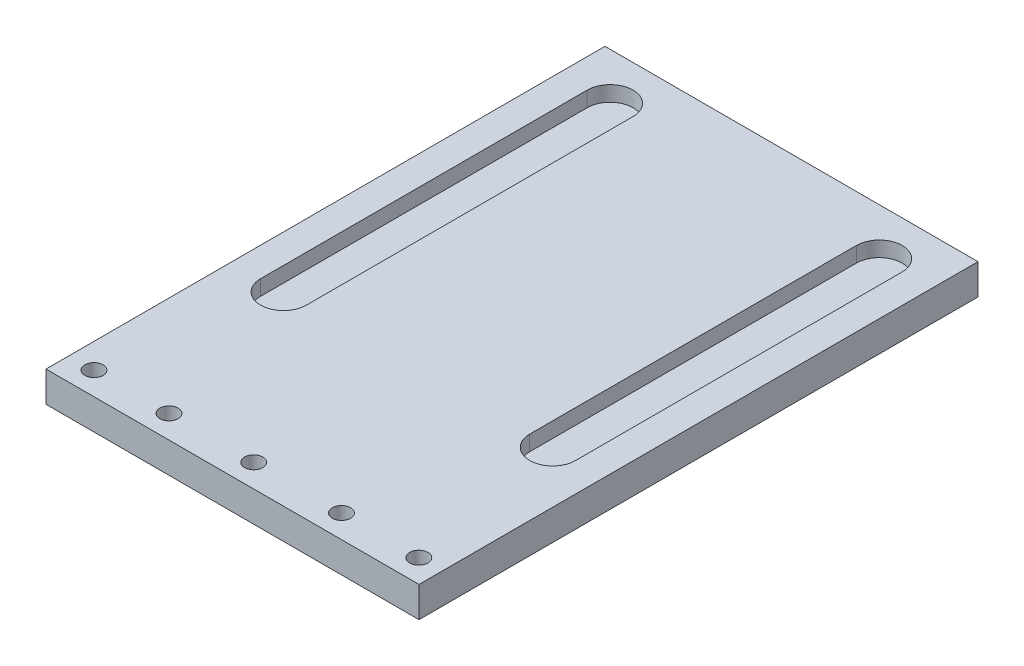
ISO-10303-21;
HEADER;
FILE_DESCRIPTION(('STEP AP214'),'2;1');
FILE_NAME('part.step','',(''),(''),'','','');
FILE_SCHEMA(('AUTOMOTIVE_DESIGN { 1 0 10303 214 1 1 1 1 }'));
ENDSEC;
DATA;
#1=APPLICATION_CONTEXT('core data for automotive mechanical design processes');
#2=APPLICATION_PROTOCOL_DEFINITION('international standard','automotive_design',2000,#1);
#3=PRODUCT_CONTEXT('',#1,'mechanical');
#4=PRODUCT('Part','Part','',(#3));
#5=PRODUCT_RELATED_PRODUCT_CATEGORY('part','',(#4));
#6=PRODUCT_DEFINITION_FORMATION('','',#4);
#7=PRODUCT_DEFINITION_CONTEXT('part definition',#1,'design');
#8=PRODUCT_DEFINITION('design','',#6,#7);
#9=PRODUCT_DEFINITION_SHAPE('','',#8);
#10=(LENGTH_UNIT() NAMED_UNIT(*) SI_UNIT(.MILLI.,.METRE.));
#11=(NAMED_UNIT(*) PLANE_ANGLE_UNIT() SI_UNIT($,.RADIAN.));
#12=(NAMED_UNIT(*) SI_UNIT($,.STERADIAN.) SOLID_ANGLE_UNIT());
#13=UNCERTAINTY_MEASURE_WITH_UNIT(LENGTH_MEASURE(1.E-05),#10,'distance_accuracy_value','');
#14=(GEOMETRIC_REPRESENTATION_CONTEXT(3) GLOBAL_UNCERTAINTY_ASSIGNED_CONTEXT((#13)) GLOBAL_UNIT_ASSIGNED_CONTEXT((#10,
#11,#12)) REPRESENTATION_CONTEXT('',''));
#15=CARTESIAN_POINT('',(0.,0.,0.));
#16=DIRECTION('',(0.,0.,1.));
#17=DIRECTION('',(1.,0.,0.));
#18=AXIS2_PLACEMENT_3D('',#15,#16,#17);
#19=CARTESIAN_POINT('',(-1.60746573856236,94.0965075155709,228.829069081088));
#20=DIRECTION('',(-1.,0.,0.));
#21=DIRECTION('',(0.,0.,1.));
#22=AXIS2_PLACEMENT_3D('',#19,#20,#21);
#23=PLANE('',#22);
#24=DIRECTION('',(0.,0.,-1.));
#25=VECTOR('',#24,1.);
#26=CARTESIAN_POINT('',(-1.60746573856236,99.0965075155709,224.829069081088));
#27=LINE('',#26,#25);
#28=CARTESIAN_POINT('',(-1.60746573856236,99.0965075155709,225.999069081088));
#29=VERTEX_POINT('',#28);
#30=CARTESIAN_POINT('',(-1.60746573856238,99.0965075155709,43.0290690810878));
#31=VERTEX_POINT('',#30);
#32=EDGE_CURVE('E203',#29,#31,#27,.T.);
#33=ORIENTED_EDGE('',*,*,#32,.T.);
#34=DIRECTION('',(0.,-1.,0.));
#35=VECTOR('',#34,1.);
#36=CARTESIAN_POINT('',(-1.6074657385624,94.0965075155709,43.0290690810877));
#37=LINE('',#36,#35);
#38=CARTESIAN_POINT('',(-1.6074657385624,89.0965075155709,43.0290690810877));
#39=VERTEX_POINT('',#38);
#40=EDGE_CURVE('E131',#31,#39,#37,.T.);
#41=ORIENTED_EDGE('',*,*,#40,.T.);
#42=DIRECTION('',(0.,0.,-1.));
#43=VECTOR('',#42,1.);
#44=CARTESIAN_POINT('',(-1.60746573856236,89.0965075155709,228.829069081088));
#45=LINE('',#44,#43);
#46=CARTESIAN_POINT('',(-1.60746573856236,89.0965075155709,225.999069081088));
#47=VERTEX_POINT('',#46);
#48=EDGE_CURVE('E126',#47,#39,#45,.T.);
#49=ORIENTED_EDGE('',*,*,#48,.F.);
#50=DIRECTION('',(0.,-1.,0.));
#51=VECTOR('',#50,1.);
#52=CARTESIAN_POINT('',(-1.60746573856236,99.0965075155709,225.999069081088));
#53=LINE('',#52,#51);
#54=EDGE_CURVE('E130',#29,#47,#53,.T.);
#55=ORIENTED_EDGE('',*,*,#54,.F.);
#56=EDGE_LOOP('',(#33,#41,#49,#55));
#57=FACE_BOUND('',#56,.T.);
#58=ADVANCED_FACE('F38',(#57),#23,.T.);
#59=CARTESIAN_POINT('',(120.492534261438,94.0965075155709,228.829069081088));
#60=DIRECTION('',(-1.,0.,0.));
#61=DIRECTION('',(0.,0.,1.));
#62=AXIS2_PLACEMENT_3D('',#59,#60,#61);
#63=PLANE('',#62);
#64=DIRECTION('',(0.,-1.,0.));
#65=VECTOR('',#64,1.);
#66=CARTESIAN_POINT('',(120.492534261438,94.0965075155709,43.0290690810877));
#67=LINE('',#66,#65);
#68=CARTESIAN_POINT('',(120.492534261438,99.0965075155709,43.0290690810878));
#69=VERTEX_POINT('',#68);
#70=CARTESIAN_POINT('',(120.492534261438,89.0965075155709,43.0290690810877));
#71=VERTEX_POINT('',#70);
#72=EDGE_CURVE('E255',#69,#71,#67,.T.);
#73=ORIENTED_EDGE('',*,*,#72,.F.);
#74=DIRECTION('',(0.,0.,-1.));
#75=VECTOR('',#74,1.);
#76=CARTESIAN_POINT('',(120.492534261438,99.0965075155709,224.829069081088));
#77=LINE('',#76,#75);
#78=CARTESIAN_POINT('',(120.492534261438,99.0965075155709,225.999069081088));
#79=VERTEX_POINT('',#78);
#80=EDGE_CURVE('E251',#79,#69,#77,.T.);
#81=ORIENTED_EDGE('',*,*,#80,.F.);
#82=DIRECTION('',(0.,1.,0.));
#83=VECTOR('',#82,1.);
#84=CARTESIAN_POINT('',(120.492534261438,99.0965075155709,225.999069081088));
#85=LINE('',#84,#83);
#86=CARTESIAN_POINT('',(120.492534261438,89.0965075155709,225.999069081088));
#87=VERTEX_POINT('',#86);
#88=EDGE_CURVE('E143',#87,#79,#85,.T.);
#89=ORIENTED_EDGE('',*,*,#88,.F.);
#90=DIRECTION('',(0.,0.,-1.));
#91=VECTOR('',#90,1.);
#92=CARTESIAN_POINT('',(120.492534261438,89.0965075155709,228.829069081088));
#93=LINE('',#92,#91);
#94=EDGE_CURVE('E46',#87,#71,#93,.T.);
#95=ORIENTED_EDGE('',*,*,#94,.T.);
#96=EDGE_LOOP('',(#73,#81,#89,#95));
#97=FACE_BOUND('',#96,.T.);
#98=ADVANCED_FACE('F262',(#97),#63,.F.);
#99=CARTESIAN_POINT('',(-1.60746573856236,89.0965075155709,228.829069081088));
#100=DIRECTION('',(0.,-1.,0.));
#101=DIRECTION('',(0.,0.,-1.));
#102=AXIS2_PLACEMENT_3D('',#99,#100,#101);
#103=PLANE('',#102);
#104=CARTESIAN_POINT('',(6.53892866490935,89.0965075155709,218.449069081088));
#105=DIRECTION('',(0.,1.,0.));
#106=DIRECTION('',(0.,0.,1.));
#107=AXIS2_PLACEMENT_3D('',#104,#105,#106);
#108=CIRCLE('',#107,3.);
#109=CARTESIAN_POINT('',(6.53892866490935,89.0965075155709,221.449069081088));
#110=VERTEX_POINT('',#109);
#111=EDGE_CURVE('E150',#110,#110,#108,.T.);
#112=ORIENTED_EDGE('',*,*,#111,.T.);
#113=EDGE_LOOP('',(#112));
#114=FACE_BOUND('',#113,.T.);
#115=CARTESIAN_POINT('',(31.0950342702654,89.0965075155709,218.449069081088));
#116=DIRECTION('',(0.,1.,0.));
#117=DIRECTION('',(0.,0.,1.));
#118=AXIS2_PLACEMENT_3D('',#115,#116,#117);
#119=CIRCLE('',#118,3.);
#120=CARTESIAN_POINT('',(31.0950342702654,89.0965075155709,221.449069081088));
#121=VERTEX_POINT('',#120);
#122=EDGE_CURVE('E513',#121,#121,#119,.T.);
#123=ORIENTED_EDGE('',*,*,#122,.T.);
#124=EDGE_LOOP('',(#123));
#125=FACE_BOUND('',#124,.T.);
#126=CARTESIAN_POINT('',(58.8289438199414,89.0965075155709,218.449069081088));
#127=DIRECTION('',(0.,1.,0.));
#128=DIRECTION('',(0.,0.,1.));
#129=AXIS2_PLACEMENT_3D('',#126,#127,#128);
#130=CIRCLE('',#129,3.);
#131=CARTESIAN_POINT('',(58.8289438199414,89.0965075155709,221.449069081088));
#132=VERTEX_POINT('',#131);
#133=EDGE_CURVE('E523',#132,#132,#130,.T.);
#134=ORIENTED_EDGE('',*,*,#133,.T.);
#135=EDGE_LOOP('',(#134));
#136=FACE_BOUND('',#135,.T.);
#137=CARTESIAN_POINT('',(87.5625097308728,89.0965075155709,218.449069081088));
#138=DIRECTION('',(0.,1.,0.));
#139=DIRECTION('',(0.,0.,1.));
#140=AXIS2_PLACEMENT_3D('',#137,#138,#139);
#141=CIRCLE('',#140,3.00000000000001);
#142=CARTESIAN_POINT('',(87.5625097308728,89.0965075155709,221.449069081088));
#143=VERTEX_POINT('',#142);
#144=EDGE_CURVE('E531',#143,#143,#141,.T.);
#145=ORIENTED_EDGE('',*,*,#144,.T.);
#146=EDGE_LOOP('',(#145));
#147=FACE_BOUND('',#146,.T.);
#148=CARTESIAN_POINT('',(112.880414696725,89.0965075155709,218.449069081088));
#149=DIRECTION('',(0.,1.,0.));
#150=DIRECTION('',(0.,0.,1.));
#151=AXIS2_PLACEMENT_3D('',#148,#149,#150);
#152=CIRCLE('',#151,3.00000000000001);
#153=CARTESIAN_POINT('',(112.880414696725,89.0965075155709,221.449069081088));
#154=VERTEX_POINT('',#153);
#155=EDGE_CURVE('E157',#154,#154,#152,.T.);
#156=ORIENTED_EDGE('',*,*,#155,.T.);
#157=EDGE_LOOP('',(#156));
#158=FACE_BOUND('',#157,.T.);
#159=ORIENTED_EDGE('',*,*,#94,.F.);
#160=DIRECTION('',(1.,0.,0.));
#161=VECTOR('',#160,1.);
#162=CARTESIAN_POINT('',(-1.60746573856236,89.0965075155709,225.999069081088));
#163=LINE('',#162,#161);
#164=EDGE_CURVE('E137',#47,#87,#163,.T.);
#165=ORIENTED_EDGE('',*,*,#164,.F.);
#166=ORIENTED_EDGE('',*,*,#48,.T.);
#167=DIRECTION('',(1.,0.,0.));
#168=VECTOR('',#167,1.);
#169=CARTESIAN_POINT('',(-1.60746573856236,89.0965075155709,43.0290690810877));
#170=LINE('',#169,#168);
#171=EDGE_CURVE('E11',#39,#71,#170,.T.);
#172=ORIENTED_EDGE('',*,*,#171,.T.);
#173=EDGE_LOOP('',(#159,#165,#166,#172));
#174=FACE_BOUND('',#173,.T.);
#175=ADVANCED_FACE('F138',(#114,#125,#136,#147,#158,#174),#103,.T.);
#176=CARTESIAN_POINT('',(-1.60746573856236,89.0965075155709,43.0290690810877));
#177=DIRECTION('',(0.,0.,-1.));
#178=DIRECTION('',(-1.,0.,0.));
#179=AXIS2_PLACEMENT_3D('',#176,#177,#178);
#180=PLANE('',#179);
#181=ORIENTED_EDGE('',*,*,#40,.F.);
#182=DIRECTION('',(1.,0.,0.));
#183=VECTOR('',#182,1.);
#184=CARTESIAN_POINT('',(-1.60746573856235,99.0965075155709,43.0290690810878));
#185=LINE('',#184,#183);
#186=EDGE_CURVE('E164',#31,#69,#185,.T.);
#187=ORIENTED_EDGE('',*,*,#186,.T.);
#188=ORIENTED_EDGE('',*,*,#72,.T.);
#189=ORIENTED_EDGE('',*,*,#171,.F.);
#190=EDGE_LOOP('',(#181,#187,#188,#189));
#191=FACE_BOUND('',#190,.T.);
#192=ADVANCED_FACE('F264',(#191),#180,.T.);
#193=CARTESIAN_POINT('',(-1.60746573856236,99.0965075155709,224.829069081088));
#194=DIRECTION('',(0.,-1.,0.));
#195=DIRECTION('',(0.,0.,-1.));
#196=AXIS2_PLACEMENT_3D('',#193,#194,#195);
#197=PLANE('',#196);
#198=CARTESIAN_POINT('',(6.53892866490935,99.0965075155709,218.449069081088));
#199=DIRECTION('',(0.,1.,0.));
#200=DIRECTION('',(0.,0.,1.));
#201=AXIS2_PLACEMENT_3D('',#198,#199,#200);
#202=CIRCLE('',#201,3.);
#203=CARTESIAN_POINT('',(6.53892866490935,99.0965075155709,221.449069081088));
#204=VERTEX_POINT('',#203);
#205=EDGE_CURVE('E154',#204,#204,#202,.T.);
#206=ORIENTED_EDGE('',*,*,#205,.F.);
#207=EDGE_LOOP('',(#206));
#208=FACE_BOUND('',#207,.T.);
#209=CARTESIAN_POINT('',(31.0950342702654,99.0965075155709,218.449069081088));
#210=DIRECTION('',(0.,1.,0.));
#211=DIRECTION('',(0.,0.,1.));
#212=AXIS2_PLACEMENT_3D('',#209,#210,#211);
#213=CIRCLE('',#212,3.);
#214=CARTESIAN_POINT('',(31.0950342702654,99.0965075155709,221.449069081088));
#215=VERTEX_POINT('',#214);
#216=EDGE_CURVE('E509',#215,#215,#213,.T.);
#217=ORIENTED_EDGE('',*,*,#216,.F.);
#218=EDGE_LOOP('',(#217));
#219=FACE_BOUND('',#218,.T.);
#220=CARTESIAN_POINT('',(58.8289438199414,99.0965075155709,218.449069081088));
#221=DIRECTION('',(0.,1.,0.));
#222=DIRECTION('',(0.,0.,1.));
#223=AXIS2_PLACEMENT_3D('',#220,#221,#222);
#224=CIRCLE('',#223,3.);
#225=CARTESIAN_POINT('',(58.8289438199414,99.0965075155709,221.449069081088));
#226=VERTEX_POINT('',#225);
#227=EDGE_CURVE('E519',#226,#226,#224,.T.);
#228=ORIENTED_EDGE('',*,*,#227,.F.);
#229=EDGE_LOOP('',(#228));
#230=FACE_BOUND('',#229,.T.);
#231=CARTESIAN_POINT('',(87.5625097308728,99.0965075155709,218.449069081088));
#232=DIRECTION('',(0.,1.,0.));
#233=DIRECTION('',(0.,0.,1.));
#234=AXIS2_PLACEMENT_3D('',#231,#232,#233);
#235=CIRCLE('',#234,3.00000000000001);
#236=CARTESIAN_POINT('',(87.5625097308728,99.0965075155709,221.449069081088));
#237=VERTEX_POINT('',#236);
#238=EDGE_CURVE('E527',#237,#237,#235,.T.);
#239=ORIENTED_EDGE('',*,*,#238,.F.);
#240=EDGE_LOOP('',(#239));
#241=FACE_BOUND('',#240,.T.);
#242=CARTESIAN_POINT('',(112.880414696725,99.0965075155709,218.449069081088));
#243=DIRECTION('',(0.,1.,0.));
#244=DIRECTION('',(0.,0.,1.));
#245=AXIS2_PLACEMENT_3D('',#242,#243,#244);
#246=CIRCLE('',#245,3.00000000000001);
#247=CARTESIAN_POINT('',(112.880414696725,99.0965075155709,221.449069081088));
#248=VERTEX_POINT('',#247);
#249=EDGE_CURVE('E534',#248,#248,#246,.T.);
#250=ORIENTED_EDGE('',*,*,#249,.F.);
#251=EDGE_LOOP('',(#250));
#252=FACE_BOUND('',#251,.T.);
#253=ORIENTED_EDGE('',*,*,#80,.T.);
#254=ORIENTED_EDGE('',*,*,#186,.F.);
#255=ORIENTED_EDGE('',*,*,#32,.F.);
#256=DIRECTION('',(-1.,0.,0.));
#257=VECTOR('',#256,1.);
#258=CARTESIAN_POINT('',(-1.60746573856236,99.0965075155709,225.999069081088));
#259=LINE('',#258,#257);
#260=EDGE_CURVE('E148',#79,#29,#259,.T.);
#261=ORIENTED_EDGE('',*,*,#260,.F.);
#262=EDGE_LOOP('',(#253,#254,#255,#261));
#263=FACE_BOUND('',#262,.T.);
#264=DIRECTION('',(0.,0.,1.));
#265=VECTOR('',#264,1.);
#266=CARTESIAN_POINT('',(7.89253426143766,99.0965075155709,210.559069081088));
#267=LINE('',#266,#265);
#268=CARTESIAN_POINT('',(7.89253426143766,99.0965075155709,58.3375010610878));
#269=VERTEX_POINT('',#268);
#270=CARTESIAN_POINT('',(7.89253426143765,99.0965075155709,165.257501061088));
#271=VERTEX_POINT('',#270);
#272=EDGE_CURVE('E168',#269,#271,#267,.T.);
#273=ORIENTED_EDGE('',*,*,#272,.F.);
#274=CARTESIAN_POINT('',(15.3925342614377,99.0965075155709,58.3375010610878));
#275=DIRECTION('',(0.,1.,0.));
#276=DIRECTION('',(0.,0.,1.));
#277=AXIS2_PLACEMENT_3D('',#274,#275,#276);
#278=CIRCLE('',#277,7.49999999999997);
#279=CARTESIAN_POINT('',(22.8925342614376,99.0965075155709,58.3375010610878));
#280=VERTEX_POINT('',#279);
#281=EDGE_CURVE('E217',#280,#269,#278,.T.);
#282=ORIENTED_EDGE('',*,*,#281,.F.);
#283=DIRECTION('',(0.,0.,1.));
#284=VECTOR('',#283,1.);
#285=CARTESIAN_POINT('',(22.8925342614377,99.0965075155709,210.559069081088));
#286=LINE('',#285,#284);
#287=CARTESIAN_POINT('',(22.8925342614376,99.0965075155709,165.257501061088));
#288=VERTEX_POINT('',#287);
#289=EDGE_CURVE('E231',#280,#288,#286,.T.);
#290=ORIENTED_EDGE('',*,*,#289,.T.);
#291=CARTESIAN_POINT('',(15.3925342614376,99.0965075155709,165.257501061088));
#292=DIRECTION('',(0.,1.,0.));
#293=DIRECTION('',(0.,0.,1.));
#294=AXIS2_PLACEMENT_3D('',#291,#292,#293);
#295=CIRCLE('',#294,7.5);
#296=EDGE_CURVE('E227',#271,#288,#295,.T.);
#297=ORIENTED_EDGE('',*,*,#296,.F.);
#298=EDGE_LOOP('',(#273,#282,#290,#297));
#299=FACE_BOUND('',#298,.T.);
#300=DIRECTION('',(0.,0.,1.));
#301=VECTOR('',#300,1.);
#302=CARTESIAN_POINT('',(110.992534261438,99.0965075155709,210.559069081088));
#303=LINE('',#302,#301);
#304=CARTESIAN_POINT('',(110.992534261438,99.0965075155709,58.3375010610878));
#305=VERTEX_POINT('',#304);
#306=CARTESIAN_POINT('',(110.992534261438,99.0965075155709,165.257501061088));
#307=VERTEX_POINT('',#306);
#308=EDGE_CURVE('E188',#305,#307,#303,.T.);
#309=ORIENTED_EDGE('',*,*,#308,.T.);
#310=CARTESIAN_POINT('',(103.492534261438,99.0965075155709,165.257501061088));
#311=DIRECTION('',(0.,1.,0.));
#312=DIRECTION('',(0.,0.,1.));
#313=AXIS2_PLACEMENT_3D('',#310,#311,#312);
#314=CIRCLE('',#313,7.49999999999999);
#315=CARTESIAN_POINT('',(95.9925342614376,99.0965075155709,165.257501061088));
#316=VERTEX_POINT('',#315);
#317=EDGE_CURVE('E184',#307,#316,#314,.F.);
#318=ORIENTED_EDGE('',*,*,#317,.T.);
#319=DIRECTION('',(0.,0.,1.));
#320=VECTOR('',#319,1.);
#321=CARTESIAN_POINT('',(95.9925342614376,99.0965075155709,210.559069081088));
#322=LINE('',#321,#320);
#323=CARTESIAN_POINT('',(95.9925342614376,99.0965075155709,58.3375010610878));
#324=VERTEX_POINT('',#323);
#325=EDGE_CURVE('E173',#324,#316,#322,.T.);
#326=ORIENTED_EDGE('',*,*,#325,.F.);
#327=CARTESIAN_POINT('',(103.492534261438,99.0965075155709,58.3375010610878));
#328=DIRECTION('',(0.,1.,0.));
#329=DIRECTION('',(0.,0.,1.));
#330=AXIS2_PLACEMENT_3D('',#327,#328,#329);
#331=CIRCLE('',#330,7.49999999999997);
#332=EDGE_CURVE('E193',#324,#305,#331,.F.);
#333=ORIENTED_EDGE('',*,*,#332,.T.);
#334=EDGE_LOOP('',(#309,#318,#326,#333));
#335=FACE_BOUND('',#334,.T.);
#336=ADVANCED_FACE('F267',(#208,#219,#230,#241,#252,#263,#299,#335),#197,.F.);
#337=CARTESIAN_POINT('',(7.89253426143766,94.0965075155709,210.559069081088));
#338=DIRECTION('',(-1.,0.,0.));
#339=DIRECTION('',(0.,0.,1.));
#340=AXIS2_PLACEMENT_3D('',#337,#338,#339);
#341=PLANE('',#340);
#342=ORIENTED_EDGE('',*,*,#272,.T.);
#343=DIRECTION('',(0.,1.,0.));
#344=VECTOR('',#343,1.);
#345=CARTESIAN_POINT('',(7.89253426143766,94.0965075155709,165.257501061088));
#346=LINE('',#345,#344);
#347=CARTESIAN_POINT('',(7.89253426143766,94.0965075155709,165.257501061088));
#348=VERTEX_POINT('',#347);
#349=EDGE_CURVE('E224',#348,#271,#346,.T.);
#350=ORIENTED_EDGE('',*,*,#349,.F.);
#351=DIRECTION('',(0.,0.,1.));
#352=VECTOR('',#351,1.);
#353=CARTESIAN_POINT('',(7.89253426143766,94.0965075155709,210.559069081088));
#354=LINE('',#353,#352);
#355=CARTESIAN_POINT('',(7.8925342614377,94.0965075155709,58.3375010610878));
#356=VERTEX_POINT('',#355);
#357=EDGE_CURVE('E213',#356,#348,#354,.T.);
#358=ORIENTED_EDGE('',*,*,#357,.F.);
#359=DIRECTION('',(0.,1.,0.));
#360=VECTOR('',#359,1.);
#361=CARTESIAN_POINT('',(7.89253426143766,94.0965075155709,58.3375010610878));
#362=LINE('',#361,#360);
#363=EDGE_CURVE('E189',#356,#269,#362,.T.);
#364=ORIENTED_EDGE('',*,*,#363,.T.);
#365=EDGE_LOOP('',(#342,#350,#358,#364));
#366=FACE_BOUND('',#365,.T.);
#367=ADVANCED_FACE('F270',(#366),#341,.F.);
#368=CARTESIAN_POINT('',(15.3925342614377,94.0965075155709,58.3375010610878));
#369=DIRECTION('',(0.,1.,0.));
#370=DIRECTION('',(0.,0.,1.));
#371=AXIS2_PLACEMENT_3D('',#368,#369,#370);
#372=CYLINDRICAL_SURFACE('',#371,7.49999999999997);
#373=ORIENTED_EDGE('',*,*,#281,.T.);
#374=ORIENTED_EDGE('',*,*,#363,.F.);
#375=CARTESIAN_POINT('',(15.3925342614377,94.0965075155709,58.3375010610878));
#376=DIRECTION('',(0.,1.,0.));
#377=DIRECTION('',(0.,0.,1.));
#378=AXIS2_PLACEMENT_3D('',#375,#376,#377);
#379=CIRCLE('',#378,7.49999999999997);
#380=CARTESIAN_POINT('',(22.8925342614376,94.0965075155709,58.3375010610878));
#381=VERTEX_POINT('',#380);
#382=EDGE_CURVE('E53',#381,#356,#379,.T.);
#383=ORIENTED_EDGE('',*,*,#382,.F.);
#384=DIRECTION('',(0.,1.,0.));
#385=VECTOR('',#384,1.);
#386=CARTESIAN_POINT('',(22.8925342614376,94.0965075155709,58.3375010610878));
#387=LINE('',#386,#385);
#388=EDGE_CURVE('E240',#381,#280,#387,.T.);
#389=ORIENTED_EDGE('',*,*,#388,.T.);
#390=EDGE_LOOP('',(#373,#374,#383,#389));
#391=FACE_BOUND('',#390,.T.);
#392=ADVANCED_FACE('F324',(#391),#372,.F.);
#393=CARTESIAN_POINT('',(22.8925342614377,94.0965075155709,210.559069081088));
#394=DIRECTION('',(-1.,0.,0.));
#395=DIRECTION('',(0.,0.,1.));
#396=AXIS2_PLACEMENT_3D('',#393,#394,#395);
#397=PLANE('',#396);
#398=ORIENTED_EDGE('',*,*,#289,.F.);
#399=ORIENTED_EDGE('',*,*,#388,.F.);
#400=DIRECTION('',(0.,0.,1.));
#401=VECTOR('',#400,1.);
#402=CARTESIAN_POINT('',(22.8925342614377,94.0965075155709,210.559069081088));
#403=LINE('',#402,#401);
#404=CARTESIAN_POINT('',(22.8925342614376,94.0965075155709,165.257501061088));
#405=VERTEX_POINT('',#404);
#406=EDGE_CURVE('E58',#381,#405,#403,.T.);
#407=ORIENTED_EDGE('',*,*,#406,.T.);
#408=DIRECTION('',(0.,1.,0.));
#409=VECTOR('',#408,1.);
#410=CARTESIAN_POINT('',(22.8925342614376,94.0965075155709,165.257501061088));
#411=LINE('',#410,#409);
#412=EDGE_CURVE('E243',#405,#288,#411,.T.);
#413=ORIENTED_EDGE('',*,*,#412,.T.);
#414=EDGE_LOOP('',(#398,#399,#407,#413));
#415=FACE_BOUND('',#414,.T.);
#416=ADVANCED_FACE('F329',(#415),#397,.T.);
#417=CARTESIAN_POINT('',(15.3925342614376,94.0965075155709,165.257501061088));
#418=DIRECTION('',(0.,1.,0.));
#419=DIRECTION('',(0.,0.,1.));
#420=AXIS2_PLACEMENT_3D('',#417,#418,#419);
#421=CYLINDRICAL_SURFACE('',#420,7.5);
#422=ORIENTED_EDGE('',*,*,#296,.T.);
#423=ORIENTED_EDGE('',*,*,#412,.F.);
#424=CARTESIAN_POINT('',(15.3925342614376,94.0965075155709,165.257501061088));
#425=DIRECTION('',(0.,1.,0.));
#426=DIRECTION('',(0.,0.,1.));
#427=AXIS2_PLACEMENT_3D('',#424,#425,#426);
#428=CIRCLE('',#427,7.5);
#429=EDGE_CURVE('E216',#348,#405,#428,.T.);
#430=ORIENTED_EDGE('',*,*,#429,.F.);
#431=ORIENTED_EDGE('',*,*,#349,.T.);
#432=EDGE_LOOP('',(#422,#423,#430,#431));
#433=FACE_BOUND('',#432,.T.);
#434=ADVANCED_FACE('F326',(#433),#421,.F.);
#435=CARTESIAN_POINT('',(103.492534261438,94.0965075155709,165.257501061088));
#436=DIRECTION('',(0.,1.,0.));
#437=DIRECTION('',(0.,0.,1.));
#438=AXIS2_PLACEMENT_3D('',#435,#436,#437);
#439=CYLINDRICAL_SURFACE('',#438,7.49999999999999);
#440=ORIENTED_EDGE('',*,*,#317,.F.);
#441=DIRECTION('',(0.,1.,0.));
#442=VECTOR('',#441,1.);
#443=CARTESIAN_POINT('',(110.992534261438,94.0965075155709,165.257501061088));
#444=LINE('',#443,#442);
#445=CARTESIAN_POINT('',(110.992534261438,94.0965075155709,165.257501061088));
#446=VERTEX_POINT('',#445);
#447=EDGE_CURVE('E183',#446,#307,#444,.T.);
#448=ORIENTED_EDGE('',*,*,#447,.F.);
#449=CARTESIAN_POINT('',(103.492534261438,94.0965075155709,165.257501061088));
#450=DIRECTION('',(0.,1.,0.));
#451=DIRECTION('',(0.,0.,1.));
#452=AXIS2_PLACEMENT_3D('',#449,#450,#451);
#453=CIRCLE('',#452,7.49999999999999);
#454=CARTESIAN_POINT('',(95.9925342614376,94.0965075155709,165.257501061088));
#455=VERTEX_POINT('',#454);
#456=EDGE_CURVE('E169',#446,#455,#453,.F.);
#457=ORIENTED_EDGE('',*,*,#456,.T.);
#458=DIRECTION('',(0.,1.,0.));
#459=VECTOR('',#458,1.);
#460=CARTESIAN_POINT('',(95.9925342614376,94.0965075155709,165.257501061088));
#461=LINE('',#460,#459);
#462=EDGE_CURVE('E200',#455,#316,#461,.T.);
#463=ORIENTED_EDGE('',*,*,#462,.T.);
#464=EDGE_LOOP('',(#440,#448,#457,#463));
#465=FACE_BOUND('',#464,.T.);
#466=ADVANCED_FACE('F287',(#465),#439,.F.);
#467=CARTESIAN_POINT('',(95.9925342614376,94.0965075155709,210.559069081088));
#468=DIRECTION('',(-1.,0.,0.));
#469=DIRECTION('',(0.,0.,1.));
#470=AXIS2_PLACEMENT_3D('',#467,#468,#469);
#471=PLANE('',#470);
#472=ORIENTED_EDGE('',*,*,#325,.T.);
#473=ORIENTED_EDGE('',*,*,#462,.F.);
#474=DIRECTION('',(0.,0.,1.));
#475=VECTOR('',#474,1.);
#476=CARTESIAN_POINT('',(95.9925342614376,94.0965075155709,210.559069081088));
#477=LINE('',#476,#475);
#478=CARTESIAN_POINT('',(95.9925342614376,94.0965075155709,58.3375010610878));
#479=VERTEX_POINT('',#478);
#480=EDGE_CURVE('E179',#479,#455,#477,.T.);
#481=ORIENTED_EDGE('',*,*,#480,.F.);
#482=DIRECTION('',(0.,1.,0.));
#483=VECTOR('',#482,1.);
#484=CARTESIAN_POINT('',(95.9925342614376,94.0965075155709,58.3375010610878));
#485=LINE('',#484,#483);
#486=EDGE_CURVE('E204',#479,#324,#485,.T.);
#487=ORIENTED_EDGE('',*,*,#486,.T.);
#488=EDGE_LOOP('',(#472,#473,#481,#487));
#489=FACE_BOUND('',#488,.T.);
#490=ADVANCED_FACE('F294',(#489),#471,.F.);
#491=CARTESIAN_POINT('',(103.492534261438,94.0965075155709,58.3375010610878));
#492=DIRECTION('',(0.,1.,0.));
#493=DIRECTION('',(0.,0.,1.));
#494=AXIS2_PLACEMENT_3D('',#491,#492,#493);
#495=CYLINDRICAL_SURFACE('',#494,7.49999999999997);
#496=ORIENTED_EDGE('',*,*,#332,.F.);
#497=ORIENTED_EDGE('',*,*,#486,.F.);
#498=CARTESIAN_POINT('',(103.492534261438,94.0965075155709,58.3375010610878));
#499=DIRECTION('',(0.,1.,0.));
#500=DIRECTION('',(0.,0.,1.));
#501=AXIS2_PLACEMENT_3D('',#498,#499,#500);
#502=CIRCLE('',#501,7.49999999999997);
#503=CARTESIAN_POINT('',(110.992534261438,94.0965075155709,58.3375010610878));
#504=VERTEX_POINT('',#503);
#505=EDGE_CURVE('E176',#479,#504,#502,.F.);
#506=ORIENTED_EDGE('',*,*,#505,.T.);
#507=DIRECTION('',(0.,1.,0.));
#508=VECTOR('',#507,1.);
#509=CARTESIAN_POINT('',(110.992534261438,94.0965075155709,58.3375010610878));
#510=LINE('',#509,#508);
#511=EDGE_CURVE('E207',#504,#305,#510,.T.);
#512=ORIENTED_EDGE('',*,*,#511,.T.);
#513=EDGE_LOOP('',(#496,#497,#506,#512));
#514=FACE_BOUND('',#513,.T.);
#515=ADVANCED_FACE('F296',(#514),#495,.F.);
#516=CARTESIAN_POINT('',(110.992534261438,94.0965075155709,210.559069081088));
#517=DIRECTION('',(-1.,0.,0.));
#518=DIRECTION('',(0.,0.,1.));
#519=AXIS2_PLACEMENT_3D('',#516,#517,#518);
#520=PLANE('',#519);
#521=ORIENTED_EDGE('',*,*,#308,.F.);
#522=ORIENTED_EDGE('',*,*,#511,.F.);
#523=DIRECTION('',(0.,0.,1.));
#524=VECTOR('',#523,1.);
#525=CARTESIAN_POINT('',(110.992534261438,94.0965075155709,210.559069081088));
#526=LINE('',#525,#524);
#527=EDGE_CURVE('E172',#504,#446,#526,.T.);
#528=ORIENTED_EDGE('',*,*,#527,.T.);
#529=ORIENTED_EDGE('',*,*,#447,.T.);
#530=EDGE_LOOP('',(#521,#522,#528,#529));
#531=FACE_BOUND('',#530,.T.);
#532=ADVANCED_FACE('F282',(#531),#520,.T.);
#533=CARTESIAN_POINT('',(-1.60746573856236,94.0965075155709,228.829069081088));
#534=DIRECTION('',(0.,-1.,0.));
#535=DIRECTION('',(0.,0.,-1.));
#536=AXIS2_PLACEMENT_3D('',#533,#534,#535);
#537=PLANE('',#536);
#538=ORIENTED_EDGE('',*,*,#480,.T.);
#539=ORIENTED_EDGE('',*,*,#456,.F.);
#540=ORIENTED_EDGE('',*,*,#527,.F.);
#541=ORIENTED_EDGE('',*,*,#505,.F.);
#542=EDGE_LOOP('',(#538,#539,#540,#541));
#543=FACE_BOUND('',#542,.T.);
#544=ADVANCED_FACE('F290',(#543),#537,.F.);
#545=ORIENTED_EDGE('',*,*,#357,.T.);
#546=ORIENTED_EDGE('',*,*,#429,.T.);
#547=ORIENTED_EDGE('',*,*,#406,.F.);
#548=ORIENTED_EDGE('',*,*,#382,.T.);
#549=EDGE_LOOP('',(#545,#546,#547,#548));
#550=FACE_BOUND('',#549,.T.);
#551=ADVANCED_FACE('F319',(#550),#537,.F.);
#552=CARTESIAN_POINT('',(0.,0.,225.999069081088));
#553=DIRECTION('',(0.,0.,1.));
#554=DIRECTION('',(1.,0.,0.));
#555=AXIS2_PLACEMENT_3D('',#552,#553,#554);
#556=PLANE('',#555);
#557=ORIENTED_EDGE('',*,*,#54,.T.);
#558=ORIENTED_EDGE('',*,*,#164,.T.);
#559=ORIENTED_EDGE('',*,*,#88,.T.);
#560=ORIENTED_EDGE('',*,*,#260,.T.);
#561=EDGE_LOOP('',(#557,#558,#559,#560));
#562=FACE_BOUND('',#561,.T.);
#563=ADVANCED_FACE('F146',(#562),#556,.T.);
#564=CARTESIAN_POINT('',(112.880414696725,89.0965075155709,218.449069081088));
#565=DIRECTION('',(0.,1.,0.));
#566=DIRECTION('',(0.,0.,1.));
#567=AXIS2_PLACEMENT_3D('',#564,#565,#566);
#568=CYLINDRICAL_SURFACE('',#567,3.00000000000001);
#569=ORIENTED_EDGE('',*,*,#155,.F.);
#570=EDGE_LOOP('',(#569));
#571=FACE_BOUND('',#570,.T.);
#572=ORIENTED_EDGE('',*,*,#249,.T.);
#573=EDGE_LOOP('',(#572));
#574=FACE_BOUND('',#573,.T.);
#575=ADVANCED_FACE('F446',(#571,#574),#568,.F.);
#576=CARTESIAN_POINT('',(87.5625097308728,89.0965075155709,218.449069081088));
#577=DIRECTION('',(0.,1.,0.));
#578=DIRECTION('',(0.,0.,1.));
#579=AXIS2_PLACEMENT_3D('',#576,#577,#578);
#580=CYLINDRICAL_SURFACE('',#579,3.00000000000001);
#581=ORIENTED_EDGE('',*,*,#144,.F.);
#582=EDGE_LOOP('',(#581));
#583=FACE_BOUND('',#582,.T.);
#584=ORIENTED_EDGE('',*,*,#238,.T.);
#585=EDGE_LOOP('',(#584));
#586=FACE_BOUND('',#585,.T.);
#587=ADVANCED_FACE('F460',(#583,#586),#580,.F.);
#588=CARTESIAN_POINT('',(58.8289438199414,89.0965075155709,218.449069081088));
#589=DIRECTION('',(0.,1.,0.));
#590=DIRECTION('',(0.,0.,1.));
#591=AXIS2_PLACEMENT_3D('',#588,#589,#590);
#592=CYLINDRICAL_SURFACE('',#591,3.);
#593=ORIENTED_EDGE('',*,*,#133,.F.);
#594=EDGE_LOOP('',(#593));
#595=FACE_BOUND('',#594,.T.);
#596=ORIENTED_EDGE('',*,*,#227,.T.);
#597=EDGE_LOOP('',(#596));
#598=FACE_BOUND('',#597,.T.);
#599=ADVANCED_FACE('F470',(#595,#598),#592,.F.);
#600=CARTESIAN_POINT('',(31.0950342702654,89.0965075155709,218.449069081088));
#601=DIRECTION('',(0.,1.,0.));
#602=DIRECTION('',(0.,0.,1.));
#603=AXIS2_PLACEMENT_3D('',#600,#601,#602);
#604=CYLINDRICAL_SURFACE('',#603,3.);
#605=ORIENTED_EDGE('',*,*,#122,.F.);
#606=EDGE_LOOP('',(#605));
#607=FACE_BOUND('',#606,.T.);
#608=ORIENTED_EDGE('',*,*,#216,.T.);
#609=EDGE_LOOP('',(#608));
#610=FACE_BOUND('',#609,.T.);
#611=ADVANCED_FACE('F480',(#607,#610),#604,.F.);
#612=CARTESIAN_POINT('',(6.53892866490935,89.0965075155709,218.449069081088));
#613=DIRECTION('',(0.,1.,0.));
#614=DIRECTION('',(0.,0.,1.));
#615=AXIS2_PLACEMENT_3D('',#612,#613,#614);
#616=CYLINDRICAL_SURFACE('',#615,3.);
#617=ORIENTED_EDGE('',*,*,#111,.F.);
#618=EDGE_LOOP('',(#617));
#619=FACE_BOUND('',#618,.T.);
#620=ORIENTED_EDGE('',*,*,#205,.T.);
#621=EDGE_LOOP('',(#620));
#622=FACE_BOUND('',#621,.T.);
#623=ADVANCED_FACE('F490',(#619,#622),#616,.F.);
#624=CLOSED_SHELL('',(#58,#98,#175,#192,#336,#367,#392,#416,#434,#466,#490,#515,#532,#544,#551,
#563,#575,#587,#599,#611,#623));
#625=MANIFOLD_SOLID_BREP('B2',#624);
#626=ADVANCED_BREP_SHAPE_REPRESENTATION('',(#18,#625),#14);
#627=SHAPE_DEFINITION_REPRESENTATION(#9,#626);
ENDSEC;
END-ISO-10303-21;
